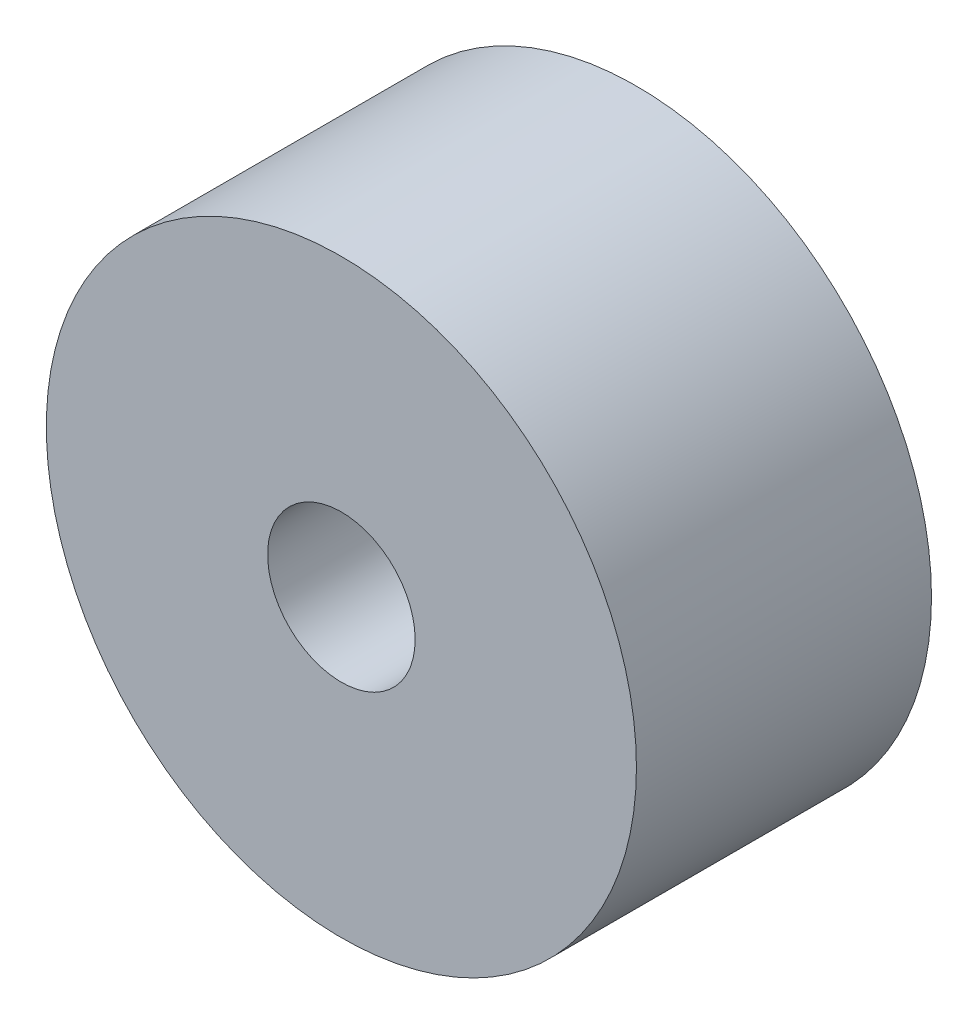
ISO-10303-21;
HEADER;
FILE_DESCRIPTION(('STEP AP214'),'2;1');
FILE_NAME('part.step','',(''),(''),'','','');
FILE_SCHEMA(('AUTOMOTIVE_DESIGN { 1 0 10303 214 1 1 1 1 }'));
ENDSEC;
DATA;
#1=APPLICATION_CONTEXT('core data for automotive mechanical design processes');
#2=APPLICATION_PROTOCOL_DEFINITION('international standard','automotive_design',2000,#1);
#3=PRODUCT_CONTEXT('',#1,'mechanical');
#4=PRODUCT('Part','Part','',(#3));
#5=PRODUCT_RELATED_PRODUCT_CATEGORY('part','',(#4));
#6=PRODUCT_DEFINITION_FORMATION('','',#4);
#7=PRODUCT_DEFINITION_CONTEXT('part definition',#1,'design');
#8=PRODUCT_DEFINITION('design','',#6,#7);
#9=PRODUCT_DEFINITION_SHAPE('','',#8);
#10=(LENGTH_UNIT() NAMED_UNIT(*) SI_UNIT(.MILLI.,.METRE.));
#11=(NAMED_UNIT(*) PLANE_ANGLE_UNIT() SI_UNIT($,.RADIAN.));
#12=(NAMED_UNIT(*) SI_UNIT($,.STERADIAN.) SOLID_ANGLE_UNIT());
#13=UNCERTAINTY_MEASURE_WITH_UNIT(LENGTH_MEASURE(1.E-05),#10,'distance_accuracy_value','');
#14=(GEOMETRIC_REPRESENTATION_CONTEXT(3) GLOBAL_UNCERTAINTY_ASSIGNED_CONTEXT((#13)) GLOBAL_UNIT_ASSIGNED_CONTEXT((#10,
#11,#12)) REPRESENTATION_CONTEXT('',''));
#15=CARTESIAN_POINT('',(0.,0.,0.));
#16=DIRECTION('',(0.,0.,1.));
#17=DIRECTION('',(1.,0.,0.));
#18=AXIS2_PLACEMENT_3D('',#15,#16,#17);
#19=CARTESIAN_POINT('',(0.,0.,5.));
#20=DIRECTION('',(0.,0.,1.));
#21=DIRECTION('',(1.,0.,0.));
#22=AXIS2_PLACEMENT_3D('',#19,#20,#21);
#23=PLANE('',#22);
#24=CARTESIAN_POINT('',(0.,0.,5.));
#25=DIRECTION('',(0.,0.,1.));
#26=DIRECTION('',(1.,0.,0.));
#27=AXIS2_PLACEMENT_3D('',#24,#25,#26);
#28=CIRCLE('',#27,10.);
#29=CARTESIAN_POINT('',(10.,0.,5.));
#30=VERTEX_POINT('',#29);
#31=EDGE_CURVE('E10',#30,#30,#28,.T.);
#32=ORIENTED_EDGE('',*,*,#31,.T.);
#33=EDGE_LOOP('',(#32));
#34=FACE_BOUND('',#33,.T.);
#35=CARTESIAN_POINT('',(0.,0.,5.));
#36=DIRECTION('',(0.,0.,1.));
#37=DIRECTION('',(1.,0.,0.));
#38=AXIS2_PLACEMENT_3D('',#35,#36,#37);
#39=CIRCLE('',#38,2.5);
#40=CARTESIAN_POINT('',(2.5,0.,5.));
#41=VERTEX_POINT('',#40);
#42=EDGE_CURVE('E42',#41,#41,#39,.T.);
#43=ORIENTED_EDGE('',*,*,#42,.F.);
#44=EDGE_LOOP('',(#43));
#45=FACE_BOUND('',#44,.T.);
#46=ADVANCED_FACE('F31',(#34,#45),#23,.T.);
#47=CARTESIAN_POINT('',(0.,0.,-5.));
#48=DIRECTION('',(0.,0.,1.));
#49=DIRECTION('',(1.,0.,0.));
#50=AXIS2_PLACEMENT_3D('',#47,#48,#49);
#51=PLANE('',#50);
#52=CARTESIAN_POINT('',(0.,0.,-5.));
#53=DIRECTION('',(0.,0.,1.));
#54=DIRECTION('',(1.,0.,0.));
#55=AXIS2_PLACEMENT_3D('',#52,#53,#54);
#56=CIRCLE('',#55,10.);
#57=CARTESIAN_POINT('',(10.,0.,-5.));
#58=VERTEX_POINT('',#57);
#59=EDGE_CURVE('E35',#58,#58,#56,.T.);
#60=ORIENTED_EDGE('',*,*,#59,.F.);
#61=EDGE_LOOP('',(#60));
#62=FACE_BOUND('',#61,.T.);
#63=CARTESIAN_POINT('',(0.,0.,-5.));
#64=DIRECTION('',(0.,0.,1.));
#65=DIRECTION('',(1.,0.,0.));
#66=AXIS2_PLACEMENT_3D('',#63,#64,#65);
#67=CIRCLE('',#66,2.5);
#68=CARTESIAN_POINT('',(2.5,0.,-5.));
#69=VERTEX_POINT('',#68);
#70=EDGE_CURVE('E44',#69,#69,#67,.T.);
#71=ORIENTED_EDGE('',*,*,#70,.T.);
#72=EDGE_LOOP('',(#71));
#73=FACE_BOUND('',#72,.T.);
#74=ADVANCED_FACE('F54',(#62,#73),#51,.F.);
#75=CARTESIAN_POINT('',(0.,0.,5.));
#76=DIRECTION('',(0.,0.,-1.));
#77=DIRECTION('',(-1.,0.,0.));
#78=AXIS2_PLACEMENT_3D('',#75,#76,#77);
#79=CYLINDRICAL_SURFACE('',#78,10.);
#80=ORIENTED_EDGE('',*,*,#31,.F.);
#81=EDGE_LOOP('',(#80));
#82=FACE_BOUND('',#81,.T.);
#83=ORIENTED_EDGE('',*,*,#59,.T.);
#84=EDGE_LOOP('',(#83));
#85=FACE_BOUND('',#84,.T.);
#86=ADVANCED_FACE('F33',(#82,#85),#79,.T.);
#87=CARTESIAN_POINT('',(0.,0.,5.));
#88=DIRECTION('',(0.,0.,-1.));
#89=DIRECTION('',(-1.,0.,0.));
#90=AXIS2_PLACEMENT_3D('',#87,#88,#89);
#91=CYLINDRICAL_SURFACE('',#90,2.5);
#92=ORIENTED_EDGE('',*,*,#42,.T.);
#93=EDGE_LOOP('',(#92));
#94=FACE_BOUND('',#93,.T.);
#95=ORIENTED_EDGE('',*,*,#70,.F.);
#96=EDGE_LOOP('',(#95));
#97=FACE_BOUND('',#96,.T.);
#98=ADVANCED_FACE('F50',(#94,#97),#91,.F.);
#99=CLOSED_SHELL('',(#46,#74,#86,#98));
#100=MANIFOLD_SOLID_BREP('B2',#99);
#101=ADVANCED_BREP_SHAPE_REPRESENTATION('',(#18,#100),#14);
#102=SHAPE_DEFINITION_REPRESENTATION(#9,#101);
ENDSEC;
END-ISO-10303-21;
